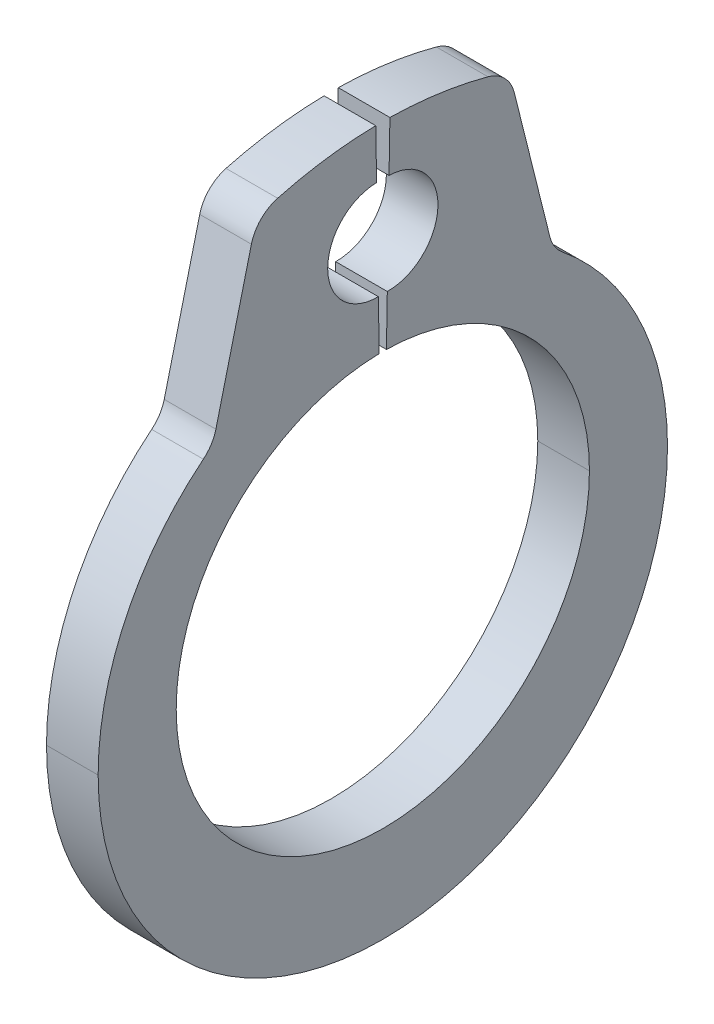
ISO-10303-21;
HEADER;
FILE_DESCRIPTION(('STEP AP214'),'2;1');
FILE_NAME('part.step','',(''),(''),'','','');
FILE_SCHEMA(('AUTOMOTIVE_DESIGN { 1 0 10303 214 1 1 1 1 }'));
ENDSEC;
DATA;
#1=APPLICATION_CONTEXT('core data for automotive mechanical design processes');
#2=APPLICATION_PROTOCOL_DEFINITION('international standard','automotive_design',2000,#1);
#3=PRODUCT_CONTEXT('',#1,'mechanical');
#4=PRODUCT('Part','Part','',(#3));
#5=PRODUCT_RELATED_PRODUCT_CATEGORY('part','',(#4));
#6=PRODUCT_DEFINITION_FORMATION('','',#4);
#7=PRODUCT_DEFINITION_CONTEXT('part definition',#1,'design');
#8=PRODUCT_DEFINITION('design','',#6,#7);
#9=PRODUCT_DEFINITION_SHAPE('','',#8);
#10=(LENGTH_UNIT() NAMED_UNIT(*) SI_UNIT(.MILLI.,.METRE.));
#11=(NAMED_UNIT(*) PLANE_ANGLE_UNIT() SI_UNIT($,.RADIAN.));
#12=(NAMED_UNIT(*) SI_UNIT($,.STERADIAN.) SOLID_ANGLE_UNIT());
#13=UNCERTAINTY_MEASURE_WITH_UNIT(LENGTH_MEASURE(1.E-05),#10,'distance_accuracy_value','');
#14=(GEOMETRIC_REPRESENTATION_CONTEXT(3) GLOBAL_UNCERTAINTY_ASSIGNED_CONTEXT((#13)) GLOBAL_UNIT_ASSIGNED_CONTEXT((#10,
#11,#12)) REPRESENTATION_CONTEXT('',''));
#15=CARTESIAN_POINT('',(0.,0.,0.));
#16=DIRECTION('',(0.,0.,1.));
#17=DIRECTION('',(1.,0.,0.));
#18=AXIS2_PLACEMENT_3D('',#15,#16,#17);
#19=CARTESIAN_POINT('',(0.35,-0.242048945637211,0.));
#20=DIRECTION('',(-1.,0.,0.));
#21=DIRECTION('',(0.,0.,1.));
#22=AXIS2_PLACEMENT_3D('',#19,#20,#21);
#23=CYLINDRICAL_SURFACE('',#22,3.85795105436279);
#24=CARTESIAN_POINT('',(0.35,-0.242048945637211,0.));
#25=DIRECTION('',(1.,0.,0.));
#26=DIRECTION('',(0.,0.,-1.));
#27=AXIS2_PLACEMENT_3D('',#24,#25,#26);
#28=CIRCLE('',#27,3.85795105436279);
#29=CARTESIAN_POINT('',(0.35,-0.242048945637211,-3.85795105436279));
#30=VERTEX_POINT('',#29);
#31=CARTESIAN_POINT('',(0.35,2.75252456841142,-2.43234779725627));
#32=VERTEX_POINT('',#31);
#33=EDGE_CURVE('E41',#30,#32,#28,.T.);
#34=ORIENTED_EDGE('',*,*,#33,.F.);
#35=DIRECTION('',(-1.,0.,0.));
#36=VECTOR('',#35,1.);
#37=CARTESIAN_POINT('',(0.35,-0.242048945637211,-3.85795105436279));
#38=LINE('',#37,#36);
#39=CARTESIAN_POINT('',(-0.35,-0.242048945637211,-3.85795105436279));
#40=VERTEX_POINT('',#39);
#41=EDGE_CURVE('E11',#30,#40,#38,.T.);
#42=ORIENTED_EDGE('',*,*,#41,.T.);
#43=CARTESIAN_POINT('',(-0.35,-0.242048945637211,0.));
#44=DIRECTION('',(1.,0.,0.));
#45=DIRECTION('',(0.,0.,-1.));
#46=AXIS2_PLACEMENT_3D('',#43,#44,#45);
#47=CIRCLE('',#46,3.85795105436279);
#48=CARTESIAN_POINT('',(-0.35,2.75252456841142,-2.43234779725627));
#49=VERTEX_POINT('',#48);
#50=EDGE_CURVE('E27',#40,#49,#47,.T.);
#51=ORIENTED_EDGE('',*,*,#50,.T.);
#52=DIRECTION('',(1.,0.,0.));
#53=VECTOR('',#52,1.);
#54=CARTESIAN_POINT('',(0.35,2.75252456841142,-2.43234779725627));
#55=LINE('',#54,#53);
#56=EDGE_CURVE('E338',#49,#32,#55,.T.);
#57=ORIENTED_EDGE('',*,*,#56,.T.);
#58=EDGE_LOOP('',(#34,#42,#51,#57));
#59=FACE_BOUND('',#58,.T.);
#60=ADVANCED_FACE('F16',(#59),#23,.T.);
#61=CARTESIAN_POINT('',(0.35,-0.242048945637211,0.));
#62=DIRECTION('',(-1.,0.,0.));
#63=DIRECTION('',(0.,0.,1.));
#64=AXIS2_PLACEMENT_3D('',#61,#62,#63);
#65=CYLINDRICAL_SURFACE('',#64,3.85795105436279);
#66=ORIENTED_EDGE('',*,*,#41,.F.);
#67=CARTESIAN_POINT('',(0.35,-0.242048945637211,0.));
#68=DIRECTION('',(1.,0.,0.));
#69=DIRECTION('',(0.,0.,-1.));
#70=AXIS2_PLACEMENT_3D('',#67,#68,#69);
#71=CIRCLE('',#70,3.85795105436279);
#72=CARTESIAN_POINT('',(0.35,-0.242048945637211,3.85795105436279));
#73=VERTEX_POINT('',#72);
#74=EDGE_CURVE('E237',#73,#30,#71,.T.);
#75=ORIENTED_EDGE('',*,*,#74,.F.);
#76=DIRECTION('',(-1.,0.,0.));
#77=VECTOR('',#76,1.);
#78=CARTESIAN_POINT('',(0.35,-0.242048945637211,3.85795105436279));
#79=LINE('',#78,#77);
#80=CARTESIAN_POINT('',(-0.35,-0.242048945637211,3.85795105436279));
#81=VERTEX_POINT('',#80);
#82=EDGE_CURVE('E246',#73,#81,#79,.T.);
#83=ORIENTED_EDGE('',*,*,#82,.T.);
#84=CARTESIAN_POINT('',(-0.35,-0.242048945637211,0.));
#85=DIRECTION('',(1.,0.,0.));
#86=DIRECTION('',(0.,0.,-1.));
#87=AXIS2_PLACEMENT_3D('',#84,#85,#86);
#88=CIRCLE('',#87,3.85795105436279);
#89=EDGE_CURVE('E209',#81,#40,#88,.T.);
#90=ORIENTED_EDGE('',*,*,#89,.T.);
#91=EDGE_LOOP('',(#66,#75,#83,#90));
#92=FACE_BOUND('',#91,.T.);
#93=ADVANCED_FACE('F509',(#92),#65,.T.);
#94=CARTESIAN_POINT('',(0.35,4.14936793489902,0.0724274867147267));
#95=DIRECTION('',(-1.,0.,0.));
#96=DIRECTION('',(0.,0.,1.));
#97=AXIS2_PLACEMENT_3D('',#94,#95,#96);
#98=CYLINDRICAL_SURFACE('',#97,0.675);
#99=CARTESIAN_POINT('',(0.35,4.14936793489902,0.0724274867147267));
#100=DIRECTION('',(-1.,0.,0.));
#101=DIRECTION('',(0.,0.,1.));
#102=AXIS2_PLACEMENT_3D('',#99,#100,#101);
#103=CIRCLE('',#102,0.675);
#104=CARTESIAN_POINT('',(0.35,4.14936793489902,0.747427486714727));
#105=VERTEX_POINT('',#104);
#106=CARTESIAN_POINT('',(0.35,4.82426512912959,0.084207861059893));
#107=VERTEX_POINT('',#106);
#108=EDGE_CURVE('E204',#105,#107,#103,.T.);
#109=ORIENTED_EDGE('',*,*,#108,.F.);
#110=DIRECTION('',(-1.,0.,0.));
#111=VECTOR('',#110,1.);
#112=CARTESIAN_POINT('',(0.35,4.14936793489902,0.747427486714727));
#113=LINE('',#112,#111);
#114=CARTESIAN_POINT('',(-0.35,4.14936793489902,0.747427486714727));
#115=VERTEX_POINT('',#114);
#116=EDGE_CURVE('E198',#105,#115,#113,.T.);
#117=ORIENTED_EDGE('',*,*,#116,.T.);
#118=CARTESIAN_POINT('',(-0.35,4.14936793489902,0.0724274867147267));
#119=DIRECTION('',(-1.,0.,0.));
#120=DIRECTION('',(0.,0.,1.));
#121=AXIS2_PLACEMENT_3D('',#118,#119,#120);
#122=CIRCLE('',#121,0.675);
#123=CARTESIAN_POINT('',(-0.35,4.82426512912959,0.084207861059893));
#124=VERTEX_POINT('',#123);
#125=EDGE_CURVE('E185',#115,#124,#122,.T.);
#126=ORIENTED_EDGE('',*,*,#125,.T.);
#127=DIRECTION('',(-1.,0.,0.));
#128=VECTOR('',#127,1.);
#129=CARTESIAN_POINT('',(0.35,4.82426512912959,0.084207861059893));
#130=LINE('',#129,#128);
#131=EDGE_CURVE('E225',#107,#124,#130,.T.);
#132=ORIENTED_EDGE('',*,*,#131,.F.);
#133=EDGE_LOOP('',(#109,#117,#126,#132));
#134=FACE_BOUND('',#133,.T.);
#135=ADVANCED_FACE('F202',(#134),#98,.F.);
#136=CARTESIAN_POINT('',(0.35,0.,0.));
#137=DIRECTION('',(-1.,0.,0.));
#138=DIRECTION('',(0.,0.,1.));
#139=AXIS2_PLACEMENT_3D('',#136,#137,#138);
#140=CYLINDRICAL_SURFACE('',#139,2.8);
#141=CARTESIAN_POINT('',(0.35,0.,0.));
#142=DIRECTION('',(-1.,0.,0.));
#143=DIRECTION('',(0.,0.,-1.));
#144=AXIS2_PLACEMENT_3D('',#141,#142,#143);
#145=CIRCLE('',#144,2.8);
#146=CARTESIAN_POINT('',(0.35,0.,-2.8));
#147=VERTEX_POINT('',#146);
#148=CARTESIAN_POINT('',(0.35,0.,2.8));
#149=VERTEX_POINT('',#148);
#150=EDGE_CURVE('E414',#147,#149,#145,.T.);
#151=ORIENTED_EDGE('',*,*,#150,.F.);
#152=DIRECTION('',(-1.,0.,0.));
#153=VECTOR('',#152,1.);
#154=CARTESIAN_POINT('',(0.35,0.,-2.8));
#155=LINE('',#154,#153);
#156=CARTESIAN_POINT('',(-0.35,0.,-2.8));
#157=VERTEX_POINT('',#156);
#158=EDGE_CURVE('E199',#147,#157,#155,.T.);
#159=ORIENTED_EDGE('',*,*,#158,.T.);
#160=CARTESIAN_POINT('',(-0.35,0.,0.));
#161=DIRECTION('',(-1.,0.,0.));
#162=DIRECTION('',(0.,0.,-1.));
#163=AXIS2_PLACEMENT_3D('',#160,#161,#162);
#164=CIRCLE('',#163,2.8);
#165=CARTESIAN_POINT('',(-0.35,0.,2.8));
#166=VERTEX_POINT('',#165);
#167=EDGE_CURVE('E250',#157,#166,#164,.T.);
#168=ORIENTED_EDGE('',*,*,#167,.T.);
#169=DIRECTION('',(-1.,0.,0.));
#170=VECTOR('',#169,1.);
#171=CARTESIAN_POINT('',(0.35,0.,2.8));
#172=LINE('',#171,#170);
#173=EDGE_CURVE('E247',#149,#166,#172,.T.);
#174=ORIENTED_EDGE('',*,*,#173,.F.);
#175=EDGE_LOOP('',(#151,#159,#168,#174));
#176=FACE_BOUND('',#175,.T.);
#177=ADVANCED_FACE('F432',(#176),#140,.F.);
#178=CARTESIAN_POINT('',(0.35,0.,0.));
#179=DIRECTION('',(-1.,0.,0.));
#180=DIRECTION('',(0.,0.,1.));
#181=AXIS2_PLACEMENT_3D('',#178,#179,#180);
#182=CYLINDRICAL_SURFACE('',#181,2.8);
#183=CARTESIAN_POINT('',(0.35,0.,0.));
#184=DIRECTION('',(-1.,0.,0.));
#185=DIRECTION('',(0.,0.,-1.));
#186=AXIS2_PLACEMENT_3D('',#183,#184,#185);
#187=CIRCLE('',#186,2.8);
#188=CARTESIAN_POINT('',(0.35,2.7995735464379,0.048866738024394));
#189=VERTEX_POINT('',#188);
#190=EDGE_CURVE('E395',#149,#189,#187,.T.);
#191=ORIENTED_EDGE('',*,*,#190,.F.);
#192=ORIENTED_EDGE('',*,*,#173,.T.);
#193=CARTESIAN_POINT('',(-0.35,0.,0.));
#194=DIRECTION('',(-1.,0.,0.));
#195=DIRECTION('',(0.,0.,-1.));
#196=AXIS2_PLACEMENT_3D('',#193,#194,#195);
#197=CIRCLE('',#196,2.8);
#198=CARTESIAN_POINT('',(-0.35,2.7995735464379,0.048866738024394));
#199=VERTEX_POINT('',#198);
#200=EDGE_CURVE('E251',#166,#199,#197,.T.);
#201=ORIENTED_EDGE('',*,*,#200,.T.);
#202=DIRECTION('',(-1.,0.,0.));
#203=VECTOR('',#202,1.);
#204=CARTESIAN_POINT('',(0.35,2.7995735464379,0.048866738024394));
#205=LINE('',#204,#203);
#206=EDGE_CURVE('E222',#189,#199,#205,.T.);
#207=ORIENTED_EDGE('',*,*,#206,.F.);
#208=EDGE_LOOP('',(#191,#192,#201,#207));
#209=FACE_BOUND('',#208,.T.);
#210=ADVANCED_FACE('F429',(#209),#182,.F.);
#211=CARTESIAN_POINT('',(0.35,0.,0.));
#212=DIRECTION('',(-1.,0.,0.));
#213=DIRECTION('',(0.,0.,1.));
#214=AXIS2_PLACEMENT_3D('',#211,#212,#213);
#215=CYLINDRICAL_SURFACE('',#214,2.8);
#216=ORIENTED_EDGE('',*,*,#158,.F.);
#217=CARTESIAN_POINT('',(0.35,0.,0.));
#218=DIRECTION('',(-1.,0.,0.));
#219=DIRECTION('',(0.,0.,-1.));
#220=AXIS2_PLACEMENT_3D('',#217,#218,#219);
#221=CIRCLE('',#220,2.8);
#222=CARTESIAN_POINT('',(0.35,2.7995735464379,-0.048866738024394));
#223=VERTEX_POINT('',#222);
#224=EDGE_CURVE('E313',#223,#147,#221,.T.);
#225=ORIENTED_EDGE('',*,*,#224,.F.);
#226=DIRECTION('',(-1.,0.,0.));
#227=VECTOR('',#226,1.);
#228=CARTESIAN_POINT('',(0.35,2.7995735464379,-0.048866738024394));
#229=LINE('',#228,#227);
#230=CARTESIAN_POINT('',(-0.35,2.7995735464379,-0.048866738024394));
#231=VERTEX_POINT('',#230);
#232=EDGE_CURVE('E325',#223,#231,#229,.T.);
#233=ORIENTED_EDGE('',*,*,#232,.T.);
#234=CARTESIAN_POINT('',(-0.35,0.,0.));
#235=DIRECTION('',(-1.,0.,0.));
#236=DIRECTION('',(0.,0.,-1.));
#237=AXIS2_PLACEMENT_3D('',#234,#235,#236);
#238=CIRCLE('',#237,2.8);
#239=EDGE_CURVE('E292',#231,#157,#238,.T.);
#240=ORIENTED_EDGE('',*,*,#239,.T.);
#241=EDGE_LOOP('',(#216,#225,#233,#240));
#242=FACE_BOUND('',#241,.T.);
#243=ADVANCED_FACE('F437',(#242),#215,.F.);
#244=CARTESIAN_POINT('',(0.35,3.47447074066846,0.0606471123695603));
#245=DIRECTION('',(0.,-0.0174524064372835,0.999847695156391));
#246=DIRECTION('',(-1.,0.,0.));
#247=AXIS2_PLACEMENT_3D('',#244,#245,#246);
#248=PLANE('',#247);
#249=DIRECTION('',(0.,0.999847695156391,0.0174524064372835));
#250=VECTOR('',#249,1.);
#251=CARTESIAN_POINT('',(-0.35,3.47447074066846,0.0606471123695603));
#252=LINE('',#251,#250);
#253=CARTESIAN_POINT('',(-0.35,3.47447074066846,0.0606471123695603));
#254=VERTEX_POINT('',#253);
#255=EDGE_CURVE('E289',#199,#254,#252,.T.);
#256=ORIENTED_EDGE('',*,*,#255,.T.);
#257=DIRECTION('',(-1.,0.,0.));
#258=VECTOR('',#257,1.);
#259=CARTESIAN_POINT('',(0.35,3.47447074066846,0.0606471123695603));
#260=LINE('',#259,#258);
#261=CARTESIAN_POINT('',(0.35,3.47447074066846,0.0606471123695603));
#262=VERTEX_POINT('',#261);
#263=EDGE_CURVE('E213',#262,#254,#260,.T.);
#264=ORIENTED_EDGE('',*,*,#263,.F.);
#265=DIRECTION('',(0.,0.999847695156391,0.0174524064372835));
#266=VECTOR('',#265,1.);
#267=CARTESIAN_POINT('',(0.35,3.47447074066846,0.0606471123695603));
#268=LINE('',#267,#266);
#269=EDGE_CURVE('E392',#189,#262,#268,.T.);
#270=ORIENTED_EDGE('',*,*,#269,.F.);
#271=ORIENTED_EDGE('',*,*,#206,.T.);
#272=EDGE_LOOP('',(#256,#264,#270,#271));
#273=FACE_BOUND('',#272,.T.);
#274=ADVANCED_FACE('F426',(#273),#248,.F.);
#275=CARTESIAN_POINT('',(0.35,4.14936793489902,0.0724274867147267));
#276=DIRECTION('',(-1.,0.,0.));
#277=DIRECTION('',(0.,0.,1.));
#278=AXIS2_PLACEMENT_3D('',#275,#276,#277);
#279=CYLINDRICAL_SURFACE('',#278,0.675);
#280=ORIENTED_EDGE('',*,*,#116,.F.);
#281=CARTESIAN_POINT('',(0.35,4.14936793489902,0.0724274867147267));
#282=DIRECTION('',(-1.,0.,0.));
#283=DIRECTION('',(0.,0.,1.));
#284=AXIS2_PLACEMENT_3D('',#281,#282,#283);
#285=CIRCLE('',#284,0.675);
#286=EDGE_CURVE('E287',#262,#105,#285,.T.);
#287=ORIENTED_EDGE('',*,*,#286,.F.);
#288=ORIENTED_EDGE('',*,*,#263,.T.);
#289=CARTESIAN_POINT('',(-0.35,4.14936793489902,0.0724274867147267));
#290=DIRECTION('',(-1.,0.,0.));
#291=DIRECTION('',(0.,0.,1.));
#292=AXIS2_PLACEMENT_3D('',#289,#290,#291);
#293=CIRCLE('',#292,0.675);
#294=EDGE_CURVE('E191',#254,#115,#293,.T.);
#295=ORIENTED_EDGE('',*,*,#294,.T.);
#296=EDGE_LOOP('',(#280,#287,#288,#295));
#297=FACE_BOUND('',#296,.T.);
#298=ADVANCED_FACE('F211',(#297),#279,.F.);
#299=CARTESIAN_POINT('',(0.35,4.82426512912959,0.0842078610598931));
#300=DIRECTION('',(0.,-0.0174524064372836,0.999847695156391));
#301=DIRECTION('',(-1.,0.,0.));
#302=AXIS2_PLACEMENT_3D('',#299,#300,#301);
#303=PLANE('',#302);
#304=DIRECTION('',(0.,0.999847695156391,0.0174524064372836));
#305=VECTOR('',#304,1.);
#306=CARTESIAN_POINT('',(-0.35,4.82426512912959,0.0842078610598931));
#307=LINE('',#306,#305);
#308=CARTESIAN_POINT('',(-0.35,5.49916232336015,0.0959882354050595));
#309=VERTEX_POINT('',#308);
#310=EDGE_CURVE('E194',#124,#309,#307,.T.);
#311=ORIENTED_EDGE('',*,*,#310,.T.);
#312=DIRECTION('',(-1.,0.,0.));
#313=VECTOR('',#312,1.);
#314=CARTESIAN_POINT('',(0.35,5.49916232336015,0.0959882354050595));
#315=LINE('',#314,#313);
#316=CARTESIAN_POINT('',(0.35,5.49916232336015,0.0959882354050595));
#317=VERTEX_POINT('',#316);
#318=EDGE_CURVE('E262',#317,#309,#315,.T.);
#319=ORIENTED_EDGE('',*,*,#318,.F.);
#320=DIRECTION('',(0.,0.999847695156391,0.0174524064372836));
#321=VECTOR('',#320,1.);
#322=CARTESIAN_POINT('',(0.35,4.82426512912959,0.0842078610598931));
#323=LINE('',#322,#321);
#324=EDGE_CURVE('E288',#107,#317,#323,.T.);
#325=ORIENTED_EDGE('',*,*,#324,.F.);
#326=ORIENTED_EDGE('',*,*,#131,.T.);
#327=EDGE_LOOP('',(#311,#319,#325,#326));
#328=FACE_BOUND('',#327,.T.);
#329=ADVANCED_FACE('F525',(#328),#303,.F.);
#330=CARTESIAN_POINT('',(0.35,0.,0.));
#331=DIRECTION('',(-1.,0.,0.));
#332=DIRECTION('',(0.,0.,1.));
#333=AXIS2_PLACEMENT_3D('',#330,#331,#332);
#334=CYLINDRICAL_SURFACE('',#333,5.4999999999999);
#335=CARTESIAN_POINT('',(-0.35,0.,0.));
#336=DIRECTION('',(1.,0.,0.));
#337=DIRECTION('',(0.,0.,-1.));
#338=AXIS2_PLACEMENT_3D('',#335,#336,#337);
#339=CIRCLE('',#338,5.4999999999999);
#340=CARTESIAN_POINT('',(-0.35,5.31203501838722,1.42558197359109));
#341=VERTEX_POINT('',#340);
#342=EDGE_CURVE('E261',#309,#341,#339,.T.);
#343=ORIENTED_EDGE('',*,*,#342,.T.);
#344=DIRECTION('',(1.,0.,0.));
#345=VECTOR('',#344,1.);
#346=CARTESIAN_POINT('',(0.35,5.31203501838722,1.42558197359109));
#347=LINE('',#346,#345);
#348=CARTESIAN_POINT('',(0.35,5.31203501838722,1.42558197359109));
#349=VERTEX_POINT('',#348);
#350=EDGE_CURVE('E257',#341,#349,#347,.T.);
#351=ORIENTED_EDGE('',*,*,#350,.T.);
#352=CARTESIAN_POINT('',(0.35,0.,0.));
#353=DIRECTION('',(1.,0.,0.));
#354=DIRECTION('',(0.,0.,-1.));
#355=AXIS2_PLACEMENT_3D('',#352,#353,#354);
#356=CIRCLE('',#355,5.4999999999999);
#357=EDGE_CURVE('E252',#317,#349,#356,.T.);
#358=ORIENTED_EDGE('',*,*,#357,.F.);
#359=ORIENTED_EDGE('',*,*,#318,.T.);
#360=EDGE_LOOP('',(#343,#351,#358,#359));
#361=FACE_BOUND('',#360,.T.);
#362=ADVANCED_FACE('F519',(#361),#334,.T.);
#363=CARTESIAN_POINT('',(0.35,5.22671083370411,1.71216058266743));
#364=DIRECTION('',(0.,-0.241921895599665,-0.970295726275997));
#365=DIRECTION('',(0.,-0.970295726275997,0.241921895599665));
#366=AXIS2_PLACEMENT_3D('',#363,#364,#365);
#367=PLANE('',#366);
#368=DIRECTION('',(0.,-0.970295726275997,0.241921895599665));
#369=VECTOR('',#368,1.);
#370=CARTESIAN_POINT('',(-0.35,5.22671083370411,1.71216058266743));
#371=LINE('',#370,#369);
#372=CARTESIAN_POINT('',(-0.35,4.95008369178821,1.78113147549354));
#373=VERTEX_POINT('',#372);
#374=CARTESIAN_POINT('',(-0.35,3.01966775566304,2.26243822550426));
#375=VERTEX_POINT('',#374);
#376=EDGE_CURVE('E328',#373,#375,#371,.T.);
#377=ORIENTED_EDGE('',*,*,#376,.T.);
#378=DIRECTION('',(1.,0.,0.));
#379=VECTOR('',#378,1.);
#380=CARTESIAN_POINT('',(0.35,3.01966775566304,2.26243822550426));
#381=LINE('',#380,#379);
#382=CARTESIAN_POINT('',(0.35,3.01966775566304,2.26243822550426));
#383=VERTEX_POINT('',#382);
#384=EDGE_CURVE('E345',#375,#383,#381,.T.);
#385=ORIENTED_EDGE('',*,*,#384,.T.);
#386=DIRECTION('',(0.,-0.970295726275997,0.241921895599665));
#387=VECTOR('',#386,1.);
#388=CARTESIAN_POINT('',(0.35,5.22671083370411,1.71216058266743));
#389=LINE('',#388,#387);
#390=CARTESIAN_POINT('',(0.35,4.95008369178821,1.78113147549354));
#391=VERTEX_POINT('',#390);
#392=EDGE_CURVE('E269',#391,#383,#389,.T.);
#393=ORIENTED_EDGE('',*,*,#392,.F.);
#394=DIRECTION('',(-1.,0.,0.));
#395=VECTOR('',#394,1.);
#396=CARTESIAN_POINT('',(0.35,4.95008369178821,1.78113147549354));
#397=LINE('',#396,#395);
#398=EDGE_CURVE('E307',#391,#373,#397,.T.);
#399=ORIENTED_EDGE('',*,*,#398,.T.);
#400=EDGE_LOOP('',(#377,#385,#393,#399));
#401=FACE_BOUND('',#400,.T.);
#402=ADVANCED_FACE('F517',(#401),#367,.F.);
#403=CARTESIAN_POINT('',(0.35,-0.242048945637211,0.));
#404=DIRECTION('',(-1.,0.,0.));
#405=DIRECTION('',(0.,0.,1.));
#406=AXIS2_PLACEMENT_3D('',#403,#404,#405);
#407=CYLINDRICAL_SURFACE('',#406,3.85795105436279);
#408=ORIENTED_EDGE('',*,*,#82,.F.);
#409=CARTESIAN_POINT('',(0.35,-0.242048945637211,0.));
#410=DIRECTION('',(1.,0.,0.));
#411=DIRECTION('',(0.,0.,-1.));
#412=AXIS2_PLACEMENT_3D('',#409,#410,#411);
#413=CIRCLE('',#412,3.85795105436279);
#414=CARTESIAN_POINT('',(0.35,2.75252456841142,2.43234779725627));
#415=VERTEX_POINT('',#414);
#416=EDGE_CURVE('E242',#415,#73,#413,.T.);
#417=ORIENTED_EDGE('',*,*,#416,.F.);
#418=DIRECTION('',(-1.,0.,0.));
#419=VECTOR('',#418,1.);
#420=CARTESIAN_POINT('',(0.35,2.75252456841142,2.43234779725627));
#421=LINE('',#420,#419);
#422=CARTESIAN_POINT('',(-0.35,2.75252456841142,2.43234779725627));
#423=VERTEX_POINT('',#422);
#424=EDGE_CURVE('E303',#415,#423,#421,.T.);
#425=ORIENTED_EDGE('',*,*,#424,.T.);
#426=CARTESIAN_POINT('',(-0.35,-0.242048945637211,0.));
#427=DIRECTION('',(1.,0.,0.));
#428=DIRECTION('',(0.,0.,-1.));
#429=AXIS2_PLACEMENT_3D('',#426,#427,#428);
#430=CIRCLE('',#429,3.85795105436279);
#431=EDGE_CURVE('E308',#423,#81,#430,.T.);
#432=ORIENTED_EDGE('',*,*,#431,.T.);
#433=EDGE_LOOP('',(#408,#417,#425,#432));
#434=FACE_BOUND('',#433,.T.);
#435=ADVANCED_FACE('F18',(#434),#407,.T.);
#436=CARTESIAN_POINT('',(0.35,5.22671083370412,-1.71216058266741));
#437=DIRECTION('',(0.,-0.241921895599669,0.970295726275996));
#438=DIRECTION('',(-1.,0.,0.));
#439=AXIS2_PLACEMENT_3D('',#436,#437,#438);
#440=PLANE('',#439);
#441=DIRECTION('',(0.,0.970295726275996,0.241921895599669));
#442=VECTOR('',#441,1.);
#443=CARTESIAN_POINT('',(-0.35,5.22671083370412,-1.71216058266741));
#444=LINE('',#443,#442);
#445=CARTESIAN_POINT('',(-0.35,3.01966775566304,-2.26243822550426));
#446=VERTEX_POINT('',#445);
#447=CARTESIAN_POINT('',(-0.35,4.95008369178822,-1.78113147549352));
#448=VERTEX_POINT('',#447);
#449=EDGE_CURVE('E321',#446,#448,#444,.T.);
#450=ORIENTED_EDGE('',*,*,#449,.T.);
#451=DIRECTION('',(1.,0.,0.));
#452=VECTOR('',#451,1.);
#453=CARTESIAN_POINT('',(0.35,4.95008369178822,-1.78113147549352));
#454=LINE('',#453,#452);
#455=CARTESIAN_POINT('',(0.35,4.95008369178822,-1.78113147549352));
#456=VERTEX_POINT('',#455);
#457=EDGE_CURVE('E233',#448,#456,#454,.T.);
#458=ORIENTED_EDGE('',*,*,#457,.T.);
#459=DIRECTION('',(0.,0.970295726275996,0.241921895599669));
#460=VECTOR('',#459,1.);
#461=CARTESIAN_POINT('',(0.35,5.22671083370412,-1.71216058266741));
#462=LINE('',#461,#460);
#463=CARTESIAN_POINT('',(0.35,3.01966775566304,-2.26243822550426));
#464=VERTEX_POINT('',#463);
#465=EDGE_CURVE('E314',#464,#456,#462,.T.);
#466=ORIENTED_EDGE('',*,*,#465,.F.);
#467=DIRECTION('',(-1.,0.,0.));
#468=VECTOR('',#467,1.);
#469=CARTESIAN_POINT('',(-0.35,3.01966775566304,-2.26243822550426));
#470=LINE('',#469,#468);
#471=EDGE_CURVE('E231',#464,#446,#470,.T.);
#472=ORIENTED_EDGE('',*,*,#471,.T.);
#473=EDGE_LOOP('',(#450,#458,#466,#472));
#474=FACE_BOUND('',#473,.T.);
#475=ADVANCED_FACE('F507',(#474),#440,.F.);
#476=CARTESIAN_POINT('',(0.35,0.,0.));
#477=DIRECTION('',(-1.,0.,0.));
#478=DIRECTION('',(0.,0.,1.));
#479=AXIS2_PLACEMENT_3D('',#476,#477,#478);
#480=CYLINDRICAL_SURFACE('',#479,5.5);
#481=CARTESIAN_POINT('',(0.35,0.,0.));
#482=DIRECTION('',(1.,0.,0.));
#483=DIRECTION('',(0.,0.,1.));
#484=AXIS2_PLACEMENT_3D('',#481,#482,#483);
#485=CIRCLE('',#484,5.5);
#486=CARTESIAN_POINT('',(0.35,5.31203501838723,-1.42558197359107));
#487=VERTEX_POINT('',#486);
#488=CARTESIAN_POINT('',(0.35,5.49916232336015,-0.0959882354050591));
#489=VERTEX_POINT('',#488);
#490=EDGE_CURVE('E281',#487,#489,#485,.T.);
#491=ORIENTED_EDGE('',*,*,#490,.F.);
#492=DIRECTION('',(-1.,0.,0.));
#493=VECTOR('',#492,1.);
#494=CARTESIAN_POINT('',(0.35,5.31203501838723,-1.42558197359107));
#495=LINE('',#494,#493);
#496=CARTESIAN_POINT('',(-0.35,5.31203501838723,-1.42558197359107));
#497=VERTEX_POINT('',#496);
#498=EDGE_CURVE('E234',#487,#497,#495,.T.);
#499=ORIENTED_EDGE('',*,*,#498,.T.);
#500=CARTESIAN_POINT('',(-0.35,0.,0.));
#501=DIRECTION('',(1.,0.,0.));
#502=DIRECTION('',(0.,0.,1.));
#503=AXIS2_PLACEMENT_3D('',#500,#501,#502);
#504=CIRCLE('',#503,5.5);
#505=CARTESIAN_POINT('',(-0.35,5.49916232336015,-0.0959882354050591));
#506=VERTEX_POINT('',#505);
#507=EDGE_CURVE('E273',#497,#506,#504,.T.);
#508=ORIENTED_EDGE('',*,*,#507,.T.);
#509=DIRECTION('',(-1.,0.,0.));
#510=VECTOR('',#509,1.);
#511=CARTESIAN_POINT('',(0.35,5.49916232336015,-0.0959882354050591));
#512=LINE('',#511,#510);
#513=EDGE_CURVE('E383',#489,#506,#512,.T.);
#514=ORIENTED_EDGE('',*,*,#513,.F.);
#515=EDGE_LOOP('',(#491,#499,#508,#514));
#516=FACE_BOUND('',#515,.T.);
#517=ADVANCED_FACE('F501',(#516),#480,.T.);
#518=CARTESIAN_POINT('',(0.35,4.82426512912959,-0.0842078610598927));
#519=DIRECTION('',(0.,-0.0174524064372835,-0.999847695156391));
#520=DIRECTION('',(0.,-0.999847695156391,0.0174524064372835));
#521=AXIS2_PLACEMENT_3D('',#518,#519,#520);
#522=PLANE('',#521);
#523=DIRECTION('',(0.,-0.999847695156391,0.0174524064372835));
#524=VECTOR('',#523,1.);
#525=CARTESIAN_POINT('',(-0.35,4.82426512912959,-0.0842078610598927));
#526=LINE('',#525,#524);
#527=CARTESIAN_POINT('',(-0.35,4.82426512912959,-0.0842078610598927));
#528=VERTEX_POINT('',#527);
#529=EDGE_CURVE('E277',#506,#528,#526,.T.);
#530=ORIENTED_EDGE('',*,*,#529,.T.);
#531=DIRECTION('',(-1.,0.,0.));
#532=VECTOR('',#531,1.);
#533=CARTESIAN_POINT('',(0.35,4.82426512912959,-0.0842078610598927));
#534=LINE('',#533,#532);
#535=CARTESIAN_POINT('',(0.35,4.82426512912959,-0.0842078610598927));
#536=VERTEX_POINT('',#535);
#537=EDGE_CURVE('E398',#536,#528,#534,.T.);
#538=ORIENTED_EDGE('',*,*,#537,.F.);
#539=DIRECTION('',(0.,-0.999847695156391,0.0174524064372835));
#540=VECTOR('',#539,1.);
#541=CARTESIAN_POINT('',(0.35,4.82426512912959,-0.0842078610598927));
#542=LINE('',#541,#540);
#543=EDGE_CURVE('E278',#489,#536,#542,.T.);
#544=ORIENTED_EDGE('',*,*,#543,.F.);
#545=ORIENTED_EDGE('',*,*,#513,.T.);
#546=EDGE_LOOP('',(#530,#538,#544,#545));
#547=FACE_BOUND('',#546,.T.);
#548=ADVANCED_FACE('F495',(#547),#522,.F.);
#549=CARTESIAN_POINT('',(0.35,4.14936793489902,-0.0724274867147264));
#550=DIRECTION('',(-1.,0.,0.));
#551=DIRECTION('',(0.,0.,1.));
#552=AXIS2_PLACEMENT_3D('',#549,#550,#551);
#553=CYLINDRICAL_SURFACE('',#552,0.675);
#554=CARTESIAN_POINT('',(-0.35,4.14936793489902,-0.0724274867147264));
#555=DIRECTION('',(-1.,0.,0.));
#556=DIRECTION('',(0.,0.,1.));
#557=AXIS2_PLACEMENT_3D('',#554,#555,#556);
#558=CIRCLE('',#557,0.675);
#559=CARTESIAN_POINT('',(-0.35,3.47447074066846,-0.0606471123695603));
#560=VERTEX_POINT('',#559);
#561=EDGE_CURVE('E385',#528,#560,#558,.T.);
#562=ORIENTED_EDGE('',*,*,#561,.T.);
#563=DIRECTION('',(-1.,0.,0.));
#564=VECTOR('',#563,1.);
#565=CARTESIAN_POINT('',(0.35,3.47447074066846,-0.0606471123695603));
#566=LINE('',#565,#564);
#567=CARTESIAN_POINT('',(0.35,3.47447074066846,-0.0606471123695603));
#568=VERTEX_POINT('',#567);
#569=EDGE_CURVE('E255',#568,#560,#566,.T.);
#570=ORIENTED_EDGE('',*,*,#569,.F.);
#571=CARTESIAN_POINT('',(0.35,4.14936793489902,-0.0724274867147264));
#572=DIRECTION('',(-1.,0.,0.));
#573=DIRECTION('',(0.,0.,1.));
#574=AXIS2_PLACEMENT_3D('',#571,#572,#573);
#575=CIRCLE('',#574,0.675);
#576=EDGE_CURVE('E229',#536,#568,#575,.T.);
#577=ORIENTED_EDGE('',*,*,#576,.F.);
#578=ORIENTED_EDGE('',*,*,#537,.T.);
#579=EDGE_LOOP('',(#562,#570,#577,#578));
#580=FACE_BOUND('',#579,.T.);
#581=ADVANCED_FACE('F493',(#580),#553,.F.);
#582=CARTESIAN_POINT('',(0.35,2.7995735464379,-0.048866738024394));
#583=DIRECTION('',(0.,-0.0174524064372831,-0.999847695156391));
#584=DIRECTION('',(0.,-0.999847695156391,0.0174524064372831));
#585=AXIS2_PLACEMENT_3D('',#582,#583,#584);
#586=PLANE('',#585);
#587=DIRECTION('',(0.,-0.999847695156391,0.0174524064372831));
#588=VECTOR('',#587,1.);
#589=CARTESIAN_POINT('',(-0.35,2.7995735464379,-0.048866738024394));
#590=LINE('',#589,#588);
#591=EDGE_CURVE('E20',#560,#231,#590,.T.);
#592=ORIENTED_EDGE('',*,*,#591,.T.);
#593=ORIENTED_EDGE('',*,*,#232,.F.);
#594=DIRECTION('',(0.,-0.999847695156391,0.0174524064372831));
#595=VECTOR('',#594,1.);
#596=CARTESIAN_POINT('',(0.35,2.7995735464379,-0.048866738024394));
#597=LINE('',#596,#595);
#598=EDGE_CURVE('E309',#568,#223,#597,.T.);
#599=ORIENTED_EDGE('',*,*,#598,.F.);
#600=ORIENTED_EDGE('',*,*,#569,.T.);
#601=EDGE_LOOP('',(#592,#593,#599,#600));
#602=FACE_BOUND('',#601,.T.);
#603=ADVANCED_FACE('F488',(#602),#586,.F.);
#604=CARTESIAN_POINT('',(0.35,0.,0.));
#605=DIRECTION('',(1.,0.,0.));
#606=DIRECTION('',(0.,1.,0.));
#607=AXIS2_PLACEMENT_3D('',#604,#605,#606);
#608=PLANE('',#607);
#609=ORIENTED_EDGE('',*,*,#357,.T.);
#610=CARTESIAN_POINT('',(0.35,4.82912274398838,1.29598361235553));
#611=DIRECTION('',(1.,0.,0.));
#612=DIRECTION('',(0.,0.,-1.));
#613=AXIS2_PLACEMENT_3D('',#610,#611,#612);
#614=CIRCLE('',#613,0.5);
#615=EDGE_CURVE('E256',#349,#391,#614,.T.);
#616=ORIENTED_EDGE('',*,*,#615,.T.);
#617=ORIENTED_EDGE('',*,*,#392,.T.);
#618=CARTESIAN_POINT('',(0.35,3.14062870346287,2.74758608864226));
#619=DIRECTION('',(-1.,0.,0.));
#620=DIRECTION('',(0.,0.,-1.));
#621=AXIS2_PLACEMENT_3D('',#618,#619,#620);
#622=CIRCLE('',#621,0.5);
#623=EDGE_CURVE('E272',#383,#415,#622,.T.);
#624=ORIENTED_EDGE('',*,*,#623,.T.);
#625=ORIENTED_EDGE('',*,*,#416,.T.);
#626=ORIENTED_EDGE('',*,*,#74,.T.);
#627=ORIENTED_EDGE('',*,*,#33,.T.);
#628=CARTESIAN_POINT('',(0.35,3.14062870346287,-2.74758608864226));
#629=DIRECTION('',(-1.,0.,0.));
#630=DIRECTION('',(0.,0.,-1.));
#631=AXIS2_PLACEMENT_3D('',#628,#629,#630);
#632=CIRCLE('',#631,0.5);
#633=EDGE_CURVE('E238',#32,#464,#632,.T.);
#634=ORIENTED_EDGE('',*,*,#633,.T.);
#635=ORIENTED_EDGE('',*,*,#465,.T.);
#636=CARTESIAN_POINT('',(0.35,4.82912274398839,-1.29598361235552));
#637=DIRECTION('',(1.,0.,0.));
#638=DIRECTION('',(0.,0.,-1.));
#639=AXIS2_PLACEMENT_3D('',#636,#637,#638);
#640=CIRCLE('',#639,0.5);
#641=EDGE_CURVE('E317',#456,#487,#640,.T.);
#642=ORIENTED_EDGE('',*,*,#641,.T.);
#643=ORIENTED_EDGE('',*,*,#490,.T.);
#644=ORIENTED_EDGE('',*,*,#543,.T.);
#645=ORIENTED_EDGE('',*,*,#576,.T.);
#646=ORIENTED_EDGE('',*,*,#598,.T.);
#647=ORIENTED_EDGE('',*,*,#224,.T.);
#648=ORIENTED_EDGE('',*,*,#150,.T.);
#649=ORIENTED_EDGE('',*,*,#190,.T.);
#650=ORIENTED_EDGE('',*,*,#269,.T.);
#651=ORIENTED_EDGE('',*,*,#286,.T.);
#652=ORIENTED_EDGE('',*,*,#108,.T.);
#653=ORIENTED_EDGE('',*,*,#324,.T.);
#654=EDGE_LOOP('',(#609,#616,#617,#624,#625,#626,#627,#634,#635,#642,#643,#644,#645,#646,#647,
#648,#649,#650,#651,#652,#653));
#655=FACE_BOUND('',#654,.T.);
#656=ADVANCED_FACE('F421',(#655),#608,.T.);
#657=CARTESIAN_POINT('',(-0.35,0.,0.));
#658=DIRECTION('',(1.,0.,0.));
#659=DIRECTION('',(0.,1.,0.));
#660=AXIS2_PLACEMENT_3D('',#657,#658,#659);
#661=PLANE('',#660);
#662=ORIENTED_EDGE('',*,*,#376,.F.);
#663=CARTESIAN_POINT('',(-0.35,4.82912274398838,1.29598361235553));
#664=DIRECTION('',(-1.,0.,0.));
#665=DIRECTION('',(0.,0.,-1.));
#666=AXIS2_PLACEMENT_3D('',#663,#664,#665);
#667=CIRCLE('',#666,0.5);
#668=EDGE_CURVE('E299',#373,#341,#667,.T.);
#669=ORIENTED_EDGE('',*,*,#668,.T.);
#670=ORIENTED_EDGE('',*,*,#342,.F.);
#671=ORIENTED_EDGE('',*,*,#310,.F.);
#672=ORIENTED_EDGE('',*,*,#125,.F.);
#673=ORIENTED_EDGE('',*,*,#294,.F.);
#674=ORIENTED_EDGE('',*,*,#255,.F.);
#675=ORIENTED_EDGE('',*,*,#200,.F.);
#676=ORIENTED_EDGE('',*,*,#167,.F.);
#677=ORIENTED_EDGE('',*,*,#239,.F.);
#678=ORIENTED_EDGE('',*,*,#591,.F.);
#679=ORIENTED_EDGE('',*,*,#561,.F.);
#680=ORIENTED_EDGE('',*,*,#529,.F.);
#681=ORIENTED_EDGE('',*,*,#507,.F.);
#682=CARTESIAN_POINT('',(-0.35,4.82912274398839,-1.29598361235552));
#683=DIRECTION('',(-1.,0.,0.));
#684=DIRECTION('',(0.,0.,-1.));
#685=AXIS2_PLACEMENT_3D('',#682,#683,#684);
#686=CIRCLE('',#685,0.5);
#687=EDGE_CURVE('E297',#497,#448,#686,.T.);
#688=ORIENTED_EDGE('',*,*,#687,.T.);
#689=ORIENTED_EDGE('',*,*,#449,.F.);
#690=CARTESIAN_POINT('',(-0.35,3.14062870346287,-2.74758608864226));
#691=DIRECTION('',(1.,0.,0.));
#692=DIRECTION('',(0.,0.,-1.));
#693=AXIS2_PLACEMENT_3D('',#690,#691,#692);
#694=CIRCLE('',#693,0.5);
#695=EDGE_CURVE('E293',#446,#49,#694,.T.);
#696=ORIENTED_EDGE('',*,*,#695,.T.);
#697=ORIENTED_EDGE('',*,*,#50,.F.);
#698=ORIENTED_EDGE('',*,*,#89,.F.);
#699=ORIENTED_EDGE('',*,*,#431,.F.);
#700=CARTESIAN_POINT('',(-0.35,3.14062870346287,2.74758608864226));
#701=DIRECTION('',(1.,0.,0.));
#702=DIRECTION('',(0.,0.,-1.));
#703=AXIS2_PLACEMENT_3D('',#700,#701,#702);
#704=CIRCLE('',#703,0.5);
#705=EDGE_CURVE('E298',#423,#375,#704,.T.);
#706=ORIENTED_EDGE('',*,*,#705,.T.);
#707=EDGE_LOOP('',(#662,#669,#670,#671,#672,#673,#674,#675,#676,#677,#678,#679,#680,#681,#688,
#689,#696,#697,#698,#699,#706));
#708=FACE_BOUND('',#707,.T.);
#709=ADVANCED_FACE('F188',(#708),#661,.F.);
#710=CARTESIAN_POINT('',(0.35,3.14062870346287,2.74758608864226));
#711=DIRECTION('',(-1.,0.,0.));
#712=DIRECTION('',(0.,0.,1.));
#713=AXIS2_PLACEMENT_3D('',#710,#711,#712);
#714=CYLINDRICAL_SURFACE('',#713,0.5);
#715=ORIENTED_EDGE('',*,*,#623,.F.);
#716=ORIENTED_EDGE('',*,*,#384,.F.);
#717=ORIENTED_EDGE('',*,*,#705,.F.);
#718=ORIENTED_EDGE('',*,*,#424,.F.);
#719=EDGE_LOOP('',(#715,#716,#717,#718));
#720=FACE_BOUND('',#719,.T.);
#721=ADVANCED_FACE('F516',(#720),#714,.F.);
#722=CARTESIAN_POINT('',(0.35,4.82912274398838,1.29598361235553));
#723=DIRECTION('',(-1.,0.,0.));
#724=DIRECTION('',(0.,0.,1.));
#725=AXIS2_PLACEMENT_3D('',#722,#723,#724);
#726=CYLINDRICAL_SURFACE('',#725,0.5);
#727=ORIENTED_EDGE('',*,*,#615,.F.);
#728=ORIENTED_EDGE('',*,*,#350,.F.);
#729=ORIENTED_EDGE('',*,*,#668,.F.);
#730=ORIENTED_EDGE('',*,*,#398,.F.);
#731=EDGE_LOOP('',(#727,#728,#729,#730));
#732=FACE_BOUND('',#731,.T.);
#733=ADVANCED_FACE('F545',(#732),#726,.T.);
#734=CARTESIAN_POINT('',(0.35,4.82912274398839,-1.29598361235552));
#735=DIRECTION('',(-1.,0.,0.));
#736=DIRECTION('',(0.,0.,1.));
#737=AXIS2_PLACEMENT_3D('',#734,#735,#736);
#738=CYLINDRICAL_SURFACE('',#737,0.5);
#739=ORIENTED_EDGE('',*,*,#641,.F.);
#740=ORIENTED_EDGE('',*,*,#457,.F.);
#741=ORIENTED_EDGE('',*,*,#687,.F.);
#742=ORIENTED_EDGE('',*,*,#498,.F.);
#743=EDGE_LOOP('',(#739,#740,#741,#742));
#744=FACE_BOUND('',#743,.T.);
#745=ADVANCED_FACE('F505',(#744),#738,.T.);
#746=CARTESIAN_POINT('',(0.35,3.14062870346287,-2.74758608864226));
#747=DIRECTION('',(-1.,0.,0.));
#748=DIRECTION('',(0.,0.,1.));
#749=AXIS2_PLACEMENT_3D('',#746,#747,#748);
#750=CYLINDRICAL_SURFACE('',#749,0.5);
#751=ORIENTED_EDGE('',*,*,#633,.F.);
#752=ORIENTED_EDGE('',*,*,#56,.F.);
#753=ORIENTED_EDGE('',*,*,#695,.F.);
#754=ORIENTED_EDGE('',*,*,#471,.F.);
#755=EDGE_LOOP('',(#751,#752,#753,#754));
#756=FACE_BOUND('',#755,.T.);
#757=ADVANCED_FACE('F469',(#756),#750,.F.);
#758=CLOSED_SHELL('',(#60,#93,#135,#177,#210,#243,#274,#298,#329,#362,#402,#435,#475,#517,#548,
#581,#603,#656,#709,#721,#733,#745,#757));
#759=MANIFOLD_SOLID_BREP('B1',#758);
#760=ADVANCED_BREP_SHAPE_REPRESENTATION('',(#18,#759),#14);
#761=SHAPE_DEFINITION_REPRESENTATION(#9,#760);
ENDSEC;
END-ISO-10303-21;
